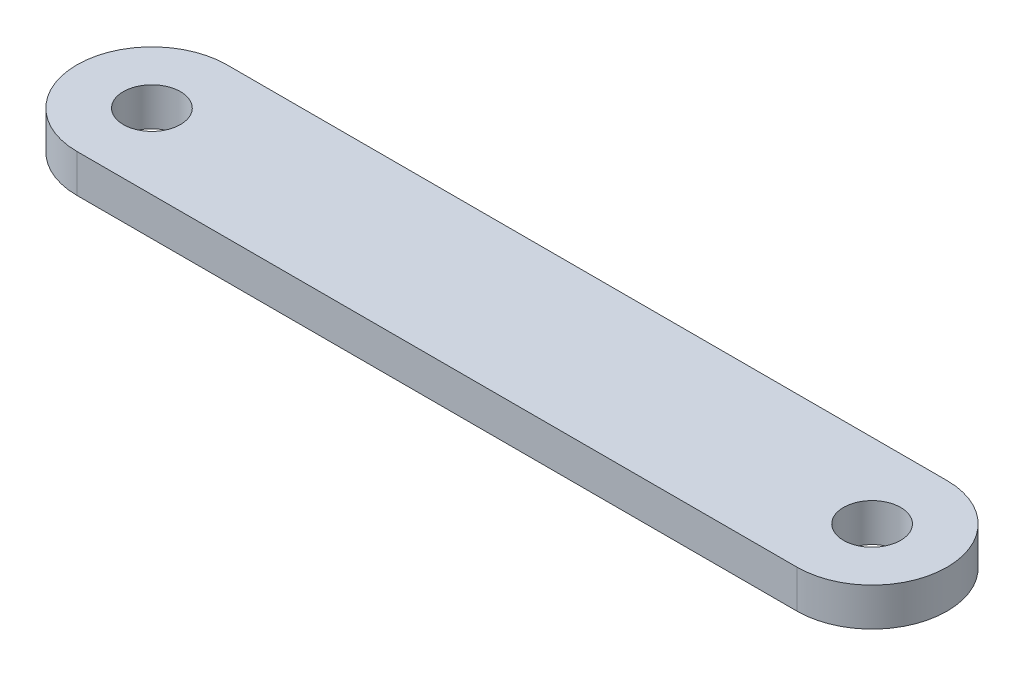
ISO-10303-21;
HEADER;
FILE_DESCRIPTION(('STEP AP214'),'2;1');
FILE_NAME('part.step','',(''),(''),'','','');
FILE_SCHEMA(('AUTOMOTIVE_DESIGN { 1 0 10303 214 1 1 1 1 }'));
ENDSEC;
DATA;
#1=APPLICATION_CONTEXT('core data for automotive mechanical design processes');
#2=APPLICATION_PROTOCOL_DEFINITION('international standard','automotive_design',2000,#1);
#3=PRODUCT_CONTEXT('',#1,'mechanical');
#4=PRODUCT('Part','Part','',(#3));
#5=PRODUCT_RELATED_PRODUCT_CATEGORY('part','',(#4));
#6=PRODUCT_DEFINITION_FORMATION('','',#4);
#7=PRODUCT_DEFINITION_CONTEXT('part definition',#1,'design');
#8=PRODUCT_DEFINITION('design','',#6,#7);
#9=PRODUCT_DEFINITION_SHAPE('','',#8);
#10=(LENGTH_UNIT() NAMED_UNIT(*) SI_UNIT(.MILLI.,.METRE.));
#11=(NAMED_UNIT(*) PLANE_ANGLE_UNIT() SI_UNIT($,.RADIAN.));
#12=(NAMED_UNIT(*) SI_UNIT($,.STERADIAN.) SOLID_ANGLE_UNIT());
#13=UNCERTAINTY_MEASURE_WITH_UNIT(LENGTH_MEASURE(1.E-05),#10,'distance_accuracy_value','');
#14=(GEOMETRIC_REPRESENTATION_CONTEXT(3) GLOBAL_UNCERTAINTY_ASSIGNED_CONTEXT((#13)) GLOBAL_UNIT_ASSIGNED_CONTEXT((#10,
#11,#12)) REPRESENTATION_CONTEXT('',''));
#15=CARTESIAN_POINT('',(0.,0.,0.));
#16=DIRECTION('',(0.,0.,1.));
#17=DIRECTION('',(1.,0.,0.));
#18=AXIS2_PLACEMENT_3D('',#15,#16,#17);
#19=CARTESIAN_POINT('',(-30.,3.175,0.));
#20=DIRECTION('',(0.,1.,0.));
#21=DIRECTION('',(0.,0.,1.));
#22=AXIS2_PLACEMENT_3D('',#19,#20,#21);
#23=PLANE('',#22);
#24=CARTESIAN_POINT('',(-30.,3.175,0.));
#25=DIRECTION('',(0.,1.,0.));
#26=DIRECTION('',(0.,0.,1.));
#27=AXIS2_PLACEMENT_3D('',#24,#25,#26);
#28=CIRCLE('',#27,2.38);
#29=CARTESIAN_POINT('',(-30.,3.175,2.38));
#30=VERTEX_POINT('',#29);
#31=EDGE_CURVE('E99',#30,#30,#28,.T.);
#32=ORIENTED_EDGE('',*,*,#31,.F.);
#33=EDGE_LOOP('',(#32));
#34=FACE_BOUND('',#33,.T.);
#35=CARTESIAN_POINT('',(-30.,3.175,0.));
#36=DIRECTION('',(0.,1.,0.));
#37=DIRECTION('',(0.,0.,1.));
#38=AXIS2_PLACEMENT_3D('',#35,#36,#37);
#39=CIRCLE('',#38,6.25);
#40=CARTESIAN_POINT('',(-30.,3.175,-6.25));
#41=VERTEX_POINT('',#40);
#42=CARTESIAN_POINT('',(-30.,3.175,6.25));
#43=VERTEX_POINT('',#42);
#44=EDGE_CURVE('E84',#41,#43,#39,.T.);
#45=ORIENTED_EDGE('',*,*,#44,.T.);
#46=DIRECTION('',(1.,0.,0.));
#47=VECTOR('',#46,1.);
#48=CARTESIAN_POINT('',(-30.,3.175,6.25));
#49=LINE('',#48,#47);
#50=CARTESIAN_POINT('',(30.,3.175,6.24999999999999));
#51=VERTEX_POINT('',#50);
#52=EDGE_CURVE('E79',#43,#51,#49,.T.);
#53=ORIENTED_EDGE('',*,*,#52,.T.);
#54=CARTESIAN_POINT('',(30.,3.175,0.));
#55=DIRECTION('',(0.,1.,0.));
#56=DIRECTION('',(0.,0.,1.));
#57=AXIS2_PLACEMENT_3D('',#54,#55,#56);
#58=CIRCLE('',#57,6.25);
#59=CARTESIAN_POINT('',(30.,3.175,-6.25000000000001));
#60=VERTEX_POINT('',#59);
#61=EDGE_CURVE('E82',#51,#60,#58,.T.);
#62=ORIENTED_EDGE('',*,*,#61,.T.);
#63=DIRECTION('',(-1.,0.,0.));
#64=VECTOR('',#63,1.);
#65=CARTESIAN_POINT('',(-30.,3.175,-6.25));
#66=LINE('',#65,#64);
#67=EDGE_CURVE('E49',#60,#41,#66,.T.);
#68=ORIENTED_EDGE('',*,*,#67,.T.);
#69=EDGE_LOOP('',(#45,#53,#62,#68));
#70=FACE_BOUND('',#69,.T.);
#71=CARTESIAN_POINT('',(30.,3.175,0.));
#72=DIRECTION('',(0.,1.,0.));
#73=DIRECTION('',(0.,0.,1.));
#74=AXIS2_PLACEMENT_3D('',#71,#72,#73);
#75=CIRCLE('',#74,2.38);
#76=CARTESIAN_POINT('',(30.,3.175,2.37999999999999));
#77=VERTEX_POINT('',#76);
#78=EDGE_CURVE('E114',#77,#77,#75,.T.);
#79=ORIENTED_EDGE('',*,*,#78,.F.);
#80=EDGE_LOOP('',(#79));
#81=FACE_BOUND('',#80,.T.);
#82=ADVANCED_FACE('F32',(#34,#70,#81),#23,.T.);
#83=CARTESIAN_POINT('',(-30.,0.,0.));
#84=DIRECTION('',(0.,1.,0.));
#85=DIRECTION('',(0.,0.,1.));
#86=AXIS2_PLACEMENT_3D('',#83,#84,#85);
#87=PLANE('',#86);
#88=CARTESIAN_POINT('',(-30.,0.,0.));
#89=DIRECTION('',(0.,1.,0.));
#90=DIRECTION('',(0.,0.,1.));
#91=AXIS2_PLACEMENT_3D('',#88,#89,#90);
#92=CIRCLE('',#91,6.25);
#93=CARTESIAN_POINT('',(-30.,0.,-6.25));
#94=VERTEX_POINT('',#93);
#95=CARTESIAN_POINT('',(-30.,0.,6.25));
#96=VERTEX_POINT('',#95);
#97=EDGE_CURVE('E96',#94,#96,#92,.T.);
#98=ORIENTED_EDGE('',*,*,#97,.F.);
#99=DIRECTION('',(-1.,0.,0.));
#100=VECTOR('',#99,1.);
#101=CARTESIAN_POINT('',(-30.,0.,-6.25));
#102=LINE('',#101,#100);
#103=CARTESIAN_POINT('',(30.,0.,-6.25000000000001));
#104=VERTEX_POINT('',#103);
#105=EDGE_CURVE('E72',#104,#94,#102,.T.);
#106=ORIENTED_EDGE('',*,*,#105,.F.);
#107=CARTESIAN_POINT('',(30.,0.,0.));
#108=DIRECTION('',(0.,1.,0.));
#109=DIRECTION('',(0.,0.,1.));
#110=AXIS2_PLACEMENT_3D('',#107,#108,#109);
#111=CIRCLE('',#110,6.25);
#112=CARTESIAN_POINT('',(30.,0.,6.24999999999999));
#113=VERTEX_POINT('',#112);
#114=EDGE_CURVE('E66',#113,#104,#111,.T.);
#115=ORIENTED_EDGE('',*,*,#114,.F.);
#116=DIRECTION('',(1.,0.,0.));
#117=VECTOR('',#116,1.);
#118=CARTESIAN_POINT('',(-30.,0.,6.25));
#119=LINE('',#118,#117);
#120=EDGE_CURVE('E88',#96,#113,#119,.T.);
#121=ORIENTED_EDGE('',*,*,#120,.F.);
#122=EDGE_LOOP('',(#98,#106,#115,#121));
#123=FACE_BOUND('',#122,.T.);
#124=CARTESIAN_POINT('',(-30.,0.,0.));
#125=DIRECTION('',(0.,1.,0.));
#126=DIRECTION('',(0.,0.,1.));
#127=AXIS2_PLACEMENT_3D('',#124,#125,#126);
#128=CIRCLE('',#127,2.38);
#129=CARTESIAN_POINT('',(-30.,0.,2.38));
#130=VERTEX_POINT('',#129);
#131=EDGE_CURVE('E111',#130,#130,#128,.T.);
#132=ORIENTED_EDGE('',*,*,#131,.T.);
#133=EDGE_LOOP('',(#132));
#134=FACE_BOUND('',#133,.T.);
#135=CARTESIAN_POINT('',(30.,0.,0.));
#136=DIRECTION('',(0.,1.,0.));
#137=DIRECTION('',(0.,0.,1.));
#138=AXIS2_PLACEMENT_3D('',#135,#136,#137);
#139=CIRCLE('',#138,2.38);
#140=CARTESIAN_POINT('',(30.,0.,2.37999999999999));
#141=VERTEX_POINT('',#140);
#142=EDGE_CURVE('E117',#141,#141,#139,.T.);
#143=ORIENTED_EDGE('',*,*,#142,.T.);
#144=EDGE_LOOP('',(#143));
#145=FACE_BOUND('',#144,.T.);
#146=ADVANCED_FACE('F107',(#123,#134,#145),#87,.F.);
#147=CARTESIAN_POINT('',(-30.,3.175,0.));
#148=DIRECTION('',(0.,-1.,0.));
#149=DIRECTION('',(0.,0.,-1.));
#150=AXIS2_PLACEMENT_3D('',#147,#148,#149);
#151=CYLINDRICAL_SURFACE('',#150,6.25);
#152=ORIENTED_EDGE('',*,*,#97,.T.);
#153=DIRECTION('',(0.,-1.,0.));
#154=VECTOR('',#153,1.);
#155=CARTESIAN_POINT('',(-30.,3.175,6.25));
#156=LINE('',#155,#154);
#157=EDGE_CURVE('E11',#43,#96,#156,.T.);
#158=ORIENTED_EDGE('',*,*,#157,.F.);
#159=ORIENTED_EDGE('',*,*,#44,.F.);
#160=DIRECTION('',(0.,-1.,0.));
#161=VECTOR('',#160,1.);
#162=CARTESIAN_POINT('',(-30.,3.175,-6.25));
#163=LINE('',#162,#161);
#164=EDGE_CURVE('E92',#41,#94,#163,.T.);
#165=ORIENTED_EDGE('',*,*,#164,.T.);
#166=EDGE_LOOP('',(#152,#158,#159,#165));
#167=FACE_BOUND('',#166,.T.);
#168=ADVANCED_FACE('F34',(#167),#151,.T.);
#169=CARTESIAN_POINT('',(-30.,3.175,6.25));
#170=DIRECTION('',(0.,0.,-1.));
#171=DIRECTION('',(-1.,0.,0.));
#172=AXIS2_PLACEMENT_3D('',#169,#170,#171);
#173=PLANE('',#172);
#174=ORIENTED_EDGE('',*,*,#120,.T.);
#175=DIRECTION('',(0.,-1.,0.));
#176=VECTOR('',#175,1.);
#177=CARTESIAN_POINT('',(30.,3.175,6.24999999999999));
#178=LINE('',#177,#176);
#179=EDGE_CURVE('E41',#51,#113,#178,.T.);
#180=ORIENTED_EDGE('',*,*,#179,.F.);
#181=ORIENTED_EDGE('',*,*,#52,.F.);
#182=ORIENTED_EDGE('',*,*,#157,.T.);
#183=EDGE_LOOP('',(#174,#180,#181,#182));
#184=FACE_BOUND('',#183,.T.);
#185=ADVANCED_FACE('F87',(#184),#173,.F.);
#186=CARTESIAN_POINT('',(30.,3.175,0.));
#187=DIRECTION('',(0.,-1.,0.));
#188=DIRECTION('',(0.,0.,-1.));
#189=AXIS2_PLACEMENT_3D('',#186,#187,#188);
#190=CYLINDRICAL_SURFACE('',#189,6.25);
#191=ORIENTED_EDGE('',*,*,#114,.T.);
#192=DIRECTION('',(0.,-1.,0.));
#193=VECTOR('',#192,1.);
#194=CARTESIAN_POINT('',(30.,3.175,-6.25000000000001));
#195=LINE('',#194,#193);
#196=EDGE_CURVE('E89',#60,#104,#195,.T.);
#197=ORIENTED_EDGE('',*,*,#196,.F.);
#198=ORIENTED_EDGE('',*,*,#61,.F.);
#199=ORIENTED_EDGE('',*,*,#179,.T.);
#200=EDGE_LOOP('',(#191,#197,#198,#199));
#201=FACE_BOUND('',#200,.T.);
#202=ADVANCED_FACE('F90',(#201),#190,.T.);
#203=CARTESIAN_POINT('',(-30.,3.175,-6.25));
#204=DIRECTION('',(0.,0.,1.));
#205=DIRECTION('',(1.,0.,0.));
#206=AXIS2_PLACEMENT_3D('',#203,#204,#205);
#207=PLANE('',#206);
#208=ORIENTED_EDGE('',*,*,#105,.T.);
#209=ORIENTED_EDGE('',*,*,#164,.F.);
#210=ORIENTED_EDGE('',*,*,#67,.F.);
#211=ORIENTED_EDGE('',*,*,#196,.T.);
#212=EDGE_LOOP('',(#208,#209,#210,#211));
#213=FACE_BOUND('',#212,.T.);
#214=ADVANCED_FACE('F104',(#213),#207,.F.);
#215=CARTESIAN_POINT('',(-30.,3.175,0.));
#216=DIRECTION('',(0.,-1.,0.));
#217=DIRECTION('',(0.,0.,-1.));
#218=AXIS2_PLACEMENT_3D('',#215,#216,#217);
#219=CYLINDRICAL_SURFACE('',#218,2.38);
#220=ORIENTED_EDGE('',*,*,#31,.T.);
#221=EDGE_LOOP('',(#220));
#222=FACE_BOUND('',#221,.T.);
#223=ORIENTED_EDGE('',*,*,#131,.F.);
#224=EDGE_LOOP('',(#223));
#225=FACE_BOUND('',#224,.T.);
#226=ADVANCED_FACE('F134',(#222,#225),#219,.F.);
#227=CARTESIAN_POINT('',(30.,3.175,0.));
#228=DIRECTION('',(0.,-1.,0.));
#229=DIRECTION('',(0.,0.,-1.));
#230=AXIS2_PLACEMENT_3D('',#227,#228,#229);
#231=CYLINDRICAL_SURFACE('',#230,2.38);
#232=ORIENTED_EDGE('',*,*,#78,.T.);
#233=EDGE_LOOP('',(#232));
#234=FACE_BOUND('',#233,.T.);
#235=ORIENTED_EDGE('',*,*,#142,.F.);
#236=EDGE_LOOP('',(#235));
#237=FACE_BOUND('',#236,.T.);
#238=ADVANCED_FACE('F123',(#234,#237),#231,.F.);
#239=CLOSED_SHELL('',(#82,#146,#168,#185,#202,#214,#226,#238));
#240=MANIFOLD_SOLID_BREP('B2',#239);
#241=ADVANCED_BREP_SHAPE_REPRESENTATION('',(#18,#240),#14);
#242=SHAPE_DEFINITION_REPRESENTATION(#9,#241);
ENDSEC;
END-ISO-10303-21;
